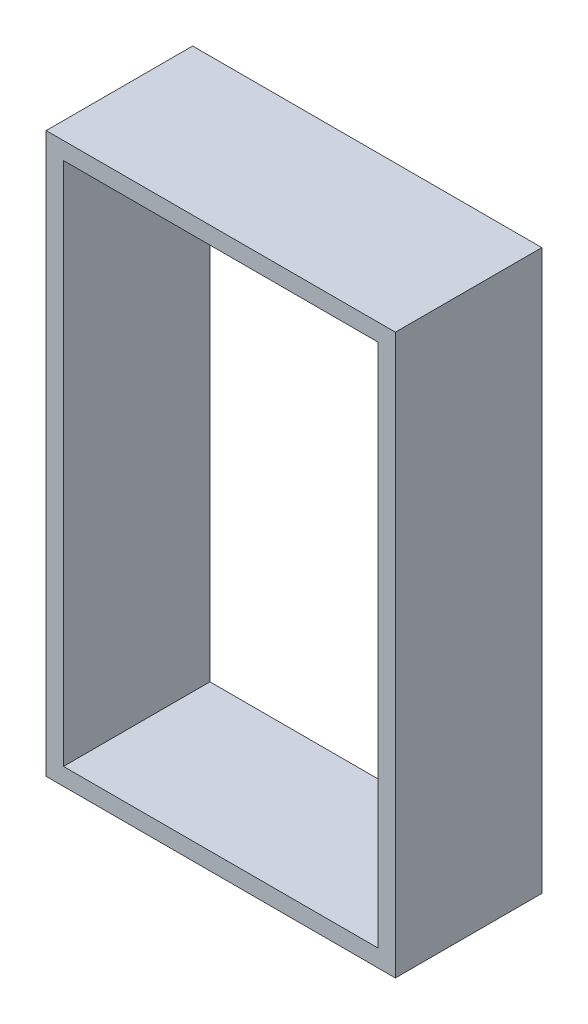
ISO-10303-21;
HEADER;
FILE_DESCRIPTION(('STEP AP214'),'2;1');
FILE_NAME('part.step','',(''),(''),'','','');
FILE_SCHEMA(('AUTOMOTIVE_DESIGN { 1 0 10303 214 1 1 1 1 }'));
ENDSEC;
DATA;
#1=APPLICATION_CONTEXT('core data for automotive mechanical design processes');
#2=APPLICATION_PROTOCOL_DEFINITION('international standard','automotive_design',2000,#1);
#3=PRODUCT_CONTEXT('',#1,'mechanical');
#4=PRODUCT('Part','Part','',(#3));
#5=PRODUCT_RELATED_PRODUCT_CATEGORY('part','',(#4));
#6=PRODUCT_DEFINITION_FORMATION('','',#4);
#7=PRODUCT_DEFINITION_CONTEXT('part definition',#1,'design');
#8=PRODUCT_DEFINITION('design','',#6,#7);
#9=PRODUCT_DEFINITION_SHAPE('','',#8);
#10=(LENGTH_UNIT() NAMED_UNIT(*) SI_UNIT(.MILLI.,.METRE.));
#11=(NAMED_UNIT(*) PLANE_ANGLE_UNIT() SI_UNIT($,.RADIAN.));
#12=(NAMED_UNIT(*) SI_UNIT($,.STERADIAN.) SOLID_ANGLE_UNIT());
#13=UNCERTAINTY_MEASURE_WITH_UNIT(LENGTH_MEASURE(1.E-05),#10,'distance_accuracy_value','');
#14=(GEOMETRIC_REPRESENTATION_CONTEXT(3) GLOBAL_UNCERTAINTY_ASSIGNED_CONTEXT((#13)) GLOBAL_UNIT_ASSIGNED_CONTEXT((#10,
#11,#12)) REPRESENTATION_CONTEXT('',''));
#15=CARTESIAN_POINT('',(0.,0.,0.));
#16=DIRECTION('',(0.,0.,1.));
#17=DIRECTION('',(1.,0.,0.));
#18=AXIS2_PLACEMENT_3D('',#15,#16,#17);
#19=CARTESIAN_POINT('',(0.,0.,6.35));
#20=DIRECTION('',(0.,0.,1.));
#21=DIRECTION('',(1.,0.,0.));
#22=AXIS2_PLACEMENT_3D('',#19,#20,#21);
#23=PLANE('',#22);
#24=DIRECTION('',(0.,-1.,0.));
#25=VECTOR('',#24,1.);
#26=CARTESIAN_POINT('',(-25.55,4.25,6.35));
#27=LINE('',#26,#25);
#28=CARTESIAN_POINT('',(-25.55,4.25,6.35));
#29=VERTEX_POINT('',#28);
#30=CARTESIAN_POINT('',(-25.55,-44.25,6.35));
#31=VERTEX_POINT('',#30);
#32=EDGE_CURVE('E145',#29,#31,#27,.T.);
#33=ORIENTED_EDGE('',*,*,#32,.T.);
#34=DIRECTION('',(1.,0.,0.));
#35=VECTOR('',#34,1.);
#36=CARTESIAN_POINT('',(-25.55,-44.25,6.35));
#37=LINE('',#36,#35);
#38=CARTESIAN_POINT('',(4.73,-44.25,6.35));
#39=VERTEX_POINT('',#38);
#40=EDGE_CURVE('E144',#31,#39,#37,.T.);
#41=ORIENTED_EDGE('',*,*,#40,.T.);
#42=DIRECTION('',(0.,1.,0.));
#43=VECTOR('',#42,1.);
#44=CARTESIAN_POINT('',(4.73,-44.25,6.35));
#45=LINE('',#44,#43);
#46=CARTESIAN_POINT('',(4.73,4.25,6.35));
#47=VERTEX_POINT('',#46);
#48=EDGE_CURVE('E149',#39,#47,#45,.T.);
#49=ORIENTED_EDGE('',*,*,#48,.T.);
#50=DIRECTION('',(-1.,0.,0.));
#51=VECTOR('',#50,1.);
#52=CARTESIAN_POINT('',(4.73,4.25,6.35));
#53=LINE('',#52,#51);
#54=EDGE_CURVE('E148',#47,#29,#53,.T.);
#55=ORIENTED_EDGE('',*,*,#54,.T.);
#56=EDGE_LOOP('',(#33,#41,#49,#55));
#57=FACE_BOUND('',#56,.T.);
#58=DIRECTION('',(1.,0.,0.));
#59=VECTOR('',#58,1.);
#60=CARTESIAN_POINT('',(-24.05,-42.75,6.35));
#61=LINE('',#60,#59);
#62=CARTESIAN_POINT('',(-24.05,-42.75,6.35));
#63=VERTEX_POINT('',#62);
#64=CARTESIAN_POINT('',(3.23,-42.75,6.35));
#65=VERTEX_POINT('',#64);
#66=EDGE_CURVE('E114',#63,#65,#61,.T.);
#67=ORIENTED_EDGE('',*,*,#66,.F.);
#68=DIRECTION('',(0.,-1.,0.));
#69=VECTOR('',#68,1.);
#70=CARTESIAN_POINT('',(-24.05,2.75,6.35));
#71=LINE('',#70,#69);
#72=CARTESIAN_POINT('',(-24.05,2.75,6.35));
#73=VERTEX_POINT('',#72);
#74=EDGE_CURVE('E107',#73,#63,#71,.T.);
#75=ORIENTED_EDGE('',*,*,#74,.F.);
#76=DIRECTION('',(-1.,0.,0.));
#77=VECTOR('',#76,1.);
#78=CARTESIAN_POINT('',(3.23,2.75,6.35));
#79=LINE('',#78,#77);
#80=CARTESIAN_POINT('',(3.23,2.75,6.35));
#81=VERTEX_POINT('',#80);
#82=EDGE_CURVE('E126',#81,#73,#79,.T.);
#83=ORIENTED_EDGE('',*,*,#82,.F.);
#84=DIRECTION('',(0.,1.,0.));
#85=VECTOR('',#84,1.);
#86=CARTESIAN_POINT('',(3.23,-42.75,6.35));
#87=LINE('',#86,#85);
#88=EDGE_CURVE('E128',#65,#81,#87,.T.);
#89=ORIENTED_EDGE('',*,*,#88,.F.);
#90=EDGE_LOOP('',(#67,#75,#83,#89));
#91=FACE_BOUND('',#90,.T.);
#92=ADVANCED_FACE('F41',(#57,#91),#23,.T.);
#93=CARTESIAN_POINT('',(0.,0.,-6.35));
#94=DIRECTION('',(0.,0.,1.));
#95=DIRECTION('',(1.,0.,0.));
#96=AXIS2_PLACEMENT_3D('',#93,#94,#95);
#97=PLANE('',#96);
#98=DIRECTION('',(0.,-1.,0.));
#99=VECTOR('',#98,1.);
#100=CARTESIAN_POINT('',(-25.55,4.25,-6.35));
#101=LINE('',#100,#99);
#102=CARTESIAN_POINT('',(-25.55,4.25,-6.35));
#103=VERTEX_POINT('',#102);
#104=CARTESIAN_POINT('',(-25.55,-44.25,-6.35));
#105=VERTEX_POINT('',#104);
#106=EDGE_CURVE('E122',#103,#105,#101,.T.);
#107=ORIENTED_EDGE('',*,*,#106,.F.);
#108=DIRECTION('',(-1.,0.,0.));
#109=VECTOR('',#108,1.);
#110=CARTESIAN_POINT('',(4.73,4.25,-6.35));
#111=LINE('',#110,#109);
#112=CARTESIAN_POINT('',(4.73,4.25,-6.35));
#113=VERTEX_POINT('',#112);
#114=EDGE_CURVE('E147',#113,#103,#111,.T.);
#115=ORIENTED_EDGE('',*,*,#114,.F.);
#116=DIRECTION('',(0.,1.,0.));
#117=VECTOR('',#116,1.);
#118=CARTESIAN_POINT('',(4.73,-44.25,-6.35));
#119=LINE('',#118,#117);
#120=CARTESIAN_POINT('',(4.73,-44.25,-6.35));
#121=VERTEX_POINT('',#120);
#122=EDGE_CURVE('E160',#121,#113,#119,.T.);
#123=ORIENTED_EDGE('',*,*,#122,.F.);
#124=DIRECTION('',(1.,0.,0.));
#125=VECTOR('',#124,1.);
#126=CARTESIAN_POINT('',(-25.55,-44.25,-6.35));
#127=LINE('',#126,#125);
#128=EDGE_CURVE('E151',#105,#121,#127,.T.);
#129=ORIENTED_EDGE('',*,*,#128,.F.);
#130=EDGE_LOOP('',(#107,#115,#123,#129));
#131=FACE_BOUND('',#130,.T.);
#132=DIRECTION('',(0.,-1.,0.));
#133=VECTOR('',#132,1.);
#134=CARTESIAN_POINT('',(-24.05,2.75,-6.35));
#135=LINE('',#134,#133);
#136=CARTESIAN_POINT('',(-24.05,2.75,-6.35));
#137=VERTEX_POINT('',#136);
#138=CARTESIAN_POINT('',(-24.05,-42.75,-6.35));
#139=VERTEX_POINT('',#138);
#140=EDGE_CURVE('E64',#137,#139,#135,.T.);
#141=ORIENTED_EDGE('',*,*,#140,.T.);
#142=DIRECTION('',(1.,0.,0.));
#143=VECTOR('',#142,1.);
#144=CARTESIAN_POINT('',(-24.05,-42.75,-6.35));
#145=LINE('',#144,#143);
#146=CARTESIAN_POINT('',(3.23,-42.75,-6.35));
#147=VERTEX_POINT('',#146);
#148=EDGE_CURVE('E123',#139,#147,#145,.T.);
#149=ORIENTED_EDGE('',*,*,#148,.T.);
#150=DIRECTION('',(0.,1.,0.));
#151=VECTOR('',#150,1.);
#152=CARTESIAN_POINT('',(3.23,-42.75,-6.35));
#153=LINE('',#152,#151);
#154=CARTESIAN_POINT('',(3.23,2.75,-6.35));
#155=VERTEX_POINT('',#154);
#156=EDGE_CURVE('E132',#147,#155,#153,.T.);
#157=ORIENTED_EDGE('',*,*,#156,.T.);
#158=DIRECTION('',(-1.,0.,0.));
#159=VECTOR('',#158,1.);
#160=CARTESIAN_POINT('',(3.23,2.75,-6.35));
#161=LINE('',#160,#159);
#162=EDGE_CURVE('E113',#155,#137,#161,.T.);
#163=ORIENTED_EDGE('',*,*,#162,.T.);
#164=EDGE_LOOP('',(#141,#149,#157,#163));
#165=FACE_BOUND('',#164,.T.);
#166=ADVANCED_FACE('F172',(#131,#165),#97,.F.);
#167=CARTESIAN_POINT('',(-25.55,4.25,6.35));
#168=DIRECTION('',(1.,0.,0.));
#169=DIRECTION('',(0.,0.,-1.));
#170=AXIS2_PLACEMENT_3D('',#167,#168,#169);
#171=PLANE('',#170);
#172=ORIENTED_EDGE('',*,*,#106,.T.);
#173=DIRECTION('',(0.,0.,-1.));
#174=VECTOR('',#173,1.);
#175=CARTESIAN_POINT('',(-25.55,-44.25,6.35));
#176=LINE('',#175,#174);
#177=EDGE_CURVE('E11',#31,#105,#176,.T.);
#178=ORIENTED_EDGE('',*,*,#177,.F.);
#179=ORIENTED_EDGE('',*,*,#32,.F.);
#180=DIRECTION('',(0.,0.,-1.));
#181=VECTOR('',#180,1.);
#182=CARTESIAN_POINT('',(-25.55,4.25,6.35));
#183=LINE('',#182,#181);
#184=EDGE_CURVE('E155',#29,#103,#183,.T.);
#185=ORIENTED_EDGE('',*,*,#184,.T.);
#186=EDGE_LOOP('',(#172,#178,#179,#185));
#187=FACE_BOUND('',#186,.T.);
#188=ADVANCED_FACE('F43',(#187),#171,.F.);
#189=CARTESIAN_POINT('',(-25.55,-44.25,6.35));
#190=DIRECTION('',(0.,1.,0.));
#191=DIRECTION('',(0.,0.,1.));
#192=AXIS2_PLACEMENT_3D('',#189,#190,#191);
#193=PLANE('',#192);
#194=ORIENTED_EDGE('',*,*,#128,.T.);
#195=DIRECTION('',(0.,0.,-1.));
#196=VECTOR('',#195,1.);
#197=CARTESIAN_POINT('',(4.73,-44.25,6.35));
#198=LINE('',#197,#196);
#199=EDGE_CURVE('E47',#39,#121,#198,.T.);
#200=ORIENTED_EDGE('',*,*,#199,.F.);
#201=ORIENTED_EDGE('',*,*,#40,.F.);
#202=ORIENTED_EDGE('',*,*,#177,.T.);
#203=EDGE_LOOP('',(#194,#200,#201,#202));
#204=FACE_BOUND('',#203,.T.);
#205=ADVANCED_FACE('F184',(#204),#193,.F.);
#206=CARTESIAN_POINT('',(4.73,-44.25,6.35));
#207=DIRECTION('',(-1.,0.,0.));
#208=DIRECTION('',(0.,0.,1.));
#209=AXIS2_PLACEMENT_3D('',#206,#207,#208);
#210=PLANE('',#209);
#211=ORIENTED_EDGE('',*,*,#122,.T.);
#212=DIRECTION('',(0.,0.,-1.));
#213=VECTOR('',#212,1.);
#214=CARTESIAN_POINT('',(4.73,4.25,6.35));
#215=LINE('',#214,#213);
#216=EDGE_CURVE('E165',#47,#113,#215,.T.);
#217=ORIENTED_EDGE('',*,*,#216,.F.);
#218=ORIENTED_EDGE('',*,*,#48,.F.);
#219=ORIENTED_EDGE('',*,*,#199,.T.);
#220=EDGE_LOOP('',(#211,#217,#218,#219));
#221=FACE_BOUND('',#220,.T.);
#222=ADVANCED_FACE('F170',(#221),#210,.F.);
#223=CARTESIAN_POINT('',(4.73,4.25,6.35));
#224=DIRECTION('',(0.,-1.,0.));
#225=DIRECTION('',(0.,0.,-1.));
#226=AXIS2_PLACEMENT_3D('',#223,#224,#225);
#227=PLANE('',#226);
#228=ORIENTED_EDGE('',*,*,#114,.T.);
#229=ORIENTED_EDGE('',*,*,#184,.F.);
#230=ORIENTED_EDGE('',*,*,#54,.F.);
#231=ORIENTED_EDGE('',*,*,#216,.T.);
#232=EDGE_LOOP('',(#228,#229,#230,#231));
#233=FACE_BOUND('',#232,.T.);
#234=ADVANCED_FACE('F177',(#233),#227,.F.);
#235=CARTESIAN_POINT('',(-24.05,2.75,6.35));
#236=DIRECTION('',(1.,0.,0.));
#237=DIRECTION('',(0.,0.,-1.));
#238=AXIS2_PLACEMENT_3D('',#235,#236,#237);
#239=PLANE('',#238);
#240=ORIENTED_EDGE('',*,*,#140,.F.);
#241=DIRECTION('',(0.,0.,-1.));
#242=VECTOR('',#241,1.);
#243=CARTESIAN_POINT('',(-24.05,2.75,6.35));
#244=LINE('',#243,#242);
#245=EDGE_CURVE('E106',#73,#137,#244,.T.);
#246=ORIENTED_EDGE('',*,*,#245,.F.);
#247=ORIENTED_EDGE('',*,*,#74,.T.);
#248=DIRECTION('',(0.,0.,-1.));
#249=VECTOR('',#248,1.);
#250=CARTESIAN_POINT('',(-24.05,-42.75,6.35));
#251=LINE('',#250,#249);
#252=EDGE_CURVE('E109',#63,#139,#251,.T.);
#253=ORIENTED_EDGE('',*,*,#252,.T.);
#254=EDGE_LOOP('',(#240,#246,#247,#253));
#255=FACE_BOUND('',#254,.T.);
#256=ADVANCED_FACE('F108',(#255),#239,.T.);
#257=CARTESIAN_POINT('',(-24.05,-42.75,6.35));
#258=DIRECTION('',(0.,1.,0.));
#259=DIRECTION('',(0.,0.,1.));
#260=AXIS2_PLACEMENT_3D('',#257,#258,#259);
#261=PLANE('',#260);
#262=ORIENTED_EDGE('',*,*,#148,.F.);
#263=ORIENTED_EDGE('',*,*,#252,.F.);
#264=ORIENTED_EDGE('',*,*,#66,.T.);
#265=DIRECTION('',(0.,0.,-1.));
#266=VECTOR('',#265,1.);
#267=CARTESIAN_POINT('',(3.23,-42.75,6.35));
#268=LINE('',#267,#266);
#269=EDGE_CURVE('E121',#65,#147,#268,.T.);
#270=ORIENTED_EDGE('',*,*,#269,.T.);
#271=EDGE_LOOP('',(#262,#263,#264,#270));
#272=FACE_BOUND('',#271,.T.);
#273=ADVANCED_FACE('F118',(#272),#261,.T.);
#274=CARTESIAN_POINT('',(3.23,-42.75,6.35));
#275=DIRECTION('',(-1.,0.,0.));
#276=DIRECTION('',(0.,0.,1.));
#277=AXIS2_PLACEMENT_3D('',#274,#275,#276);
#278=PLANE('',#277);
#279=ORIENTED_EDGE('',*,*,#156,.F.);
#280=ORIENTED_EDGE('',*,*,#269,.F.);
#281=ORIENTED_EDGE('',*,*,#88,.T.);
#282=DIRECTION('',(0.,0.,-1.));
#283=VECTOR('',#282,1.);
#284=CARTESIAN_POINT('',(3.23,2.75,6.35));
#285=LINE('',#284,#283);
#286=EDGE_CURVE('E57',#81,#155,#285,.T.);
#287=ORIENTED_EDGE('',*,*,#286,.T.);
#288=EDGE_LOOP('',(#279,#280,#281,#287));
#289=FACE_BOUND('',#288,.T.);
#290=ADVANCED_FACE('F208',(#289),#278,.T.);
#291=CARTESIAN_POINT('',(3.23,2.75,6.35));
#292=DIRECTION('',(0.,-1.,0.));
#293=DIRECTION('',(0.,0.,-1.));
#294=AXIS2_PLACEMENT_3D('',#291,#292,#293);
#295=PLANE('',#294);
#296=ORIENTED_EDGE('',*,*,#162,.F.);
#297=ORIENTED_EDGE('',*,*,#286,.F.);
#298=ORIENTED_EDGE('',*,*,#82,.T.);
#299=ORIENTED_EDGE('',*,*,#245,.T.);
#300=EDGE_LOOP('',(#296,#297,#298,#299));
#301=FACE_BOUND('',#300,.T.);
#302=ADVANCED_FACE('F212',(#301),#295,.T.);
#303=CLOSED_SHELL('',(#92,#166,#188,#205,#222,#234,#256,#273,#290,#302));
#304=MANIFOLD_SOLID_BREP('B2',#303);
#305=ADVANCED_BREP_SHAPE_REPRESENTATION('',(#18,#304),#14);
#306=SHAPE_DEFINITION_REPRESENTATION(#9,#305);
ENDSEC;
END-ISO-10303-21;
